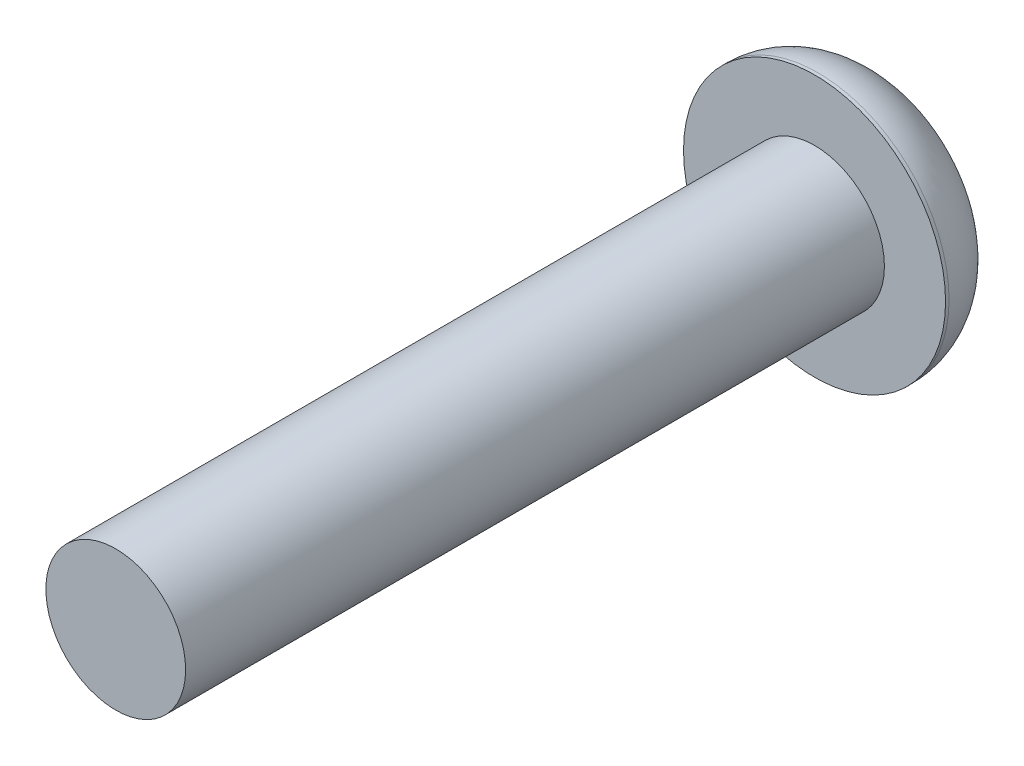
ISO-10303-21;
HEADER;
FILE_DESCRIPTION(('STEP AP214'),'2;1');
FILE_NAME('part.step','',(''),(''),'','','');
FILE_SCHEMA(('AUTOMOTIVE_DESIGN { 1 0 10303 214 1 1 1 1 }'));
ENDSEC;
DATA;
#1=APPLICATION_CONTEXT('core data for automotive mechanical design processes');
#2=APPLICATION_PROTOCOL_DEFINITION('international standard','automotive_design',2000,#1);
#3=PRODUCT_CONTEXT('',#1,'mechanical');
#4=PRODUCT('Part','Part','',(#3));
#5=PRODUCT_RELATED_PRODUCT_CATEGORY('part','',(#4));
#6=PRODUCT_DEFINITION_FORMATION('','',#4);
#7=PRODUCT_DEFINITION_CONTEXT('part definition',#1,'design');
#8=PRODUCT_DEFINITION('design','',#6,#7);
#9=PRODUCT_DEFINITION_SHAPE('','',#8);
#10=(LENGTH_UNIT() NAMED_UNIT(*) SI_UNIT(.MILLI.,.METRE.));
#11=(NAMED_UNIT(*) PLANE_ANGLE_UNIT() SI_UNIT($,.RADIAN.));
#12=(NAMED_UNIT(*) SI_UNIT($,.STERADIAN.) SOLID_ANGLE_UNIT());
#13=UNCERTAINTY_MEASURE_WITH_UNIT(LENGTH_MEASURE(1.E-05),#10,'distance_accuracy_value','');
#14=(GEOMETRIC_REPRESENTATION_CONTEXT(3) GLOBAL_UNCERTAINTY_ASSIGNED_CONTEXT((#13)) GLOBAL_UNIT_ASSIGNED_CONTEXT((#10,
#11,#12)) REPRESENTATION_CONTEXT('',''));
#15=CARTESIAN_POINT('',(0.,0.,0.));
#16=DIRECTION('',(0.,0.,1.));
#17=DIRECTION('',(1.,0.,0.));
#18=AXIS2_PLACEMENT_3D('',#15,#16,#17);
#19=CARTESIAN_POINT('',(0.,0.,20.));
#20=DIRECTION('',(0.,0.,-1.));
#21=DIRECTION('',(-1.,0.,0.));
#22=AXIS2_PLACEMENT_3D('',#19,#20,#21);
#23=CYLINDRICAL_SURFACE('',#22,2.);
#24=CARTESIAN_POINT('',(0.,0.,20.));
#25=DIRECTION('',(0.,0.,1.));
#26=DIRECTION('',(1.,0.,0.));
#27=AXIS2_PLACEMENT_3D('',#24,#25,#26);
#28=CIRCLE('',#27,2.);
#29=CARTESIAN_POINT('',(2.,0.,20.));
#30=VERTEX_POINT('',#29);
#31=EDGE_CURVE('E50',#30,#30,#28,.T.);
#32=ORIENTED_EDGE('',*,*,#31,.F.);
#33=EDGE_LOOP('',(#32));
#34=FACE_BOUND('',#33,.T.);
#35=CARTESIAN_POINT('',(0.,0.,0.));
#36=DIRECTION('',(0.,0.,1.));
#37=DIRECTION('',(1.,0.,0.));
#38=AXIS2_PLACEMENT_3D('',#35,#36,#37);
#39=CIRCLE('',#38,2.);
#40=CARTESIAN_POINT('',(2.,0.,0.));
#41=VERTEX_POINT('',#40);
#42=EDGE_CURVE('E55',#41,#41,#39,.T.);
#43=ORIENTED_EDGE('',*,*,#42,.T.);
#44=EDGE_LOOP('',(#43));
#45=FACE_BOUND('',#44,.T.);
#46=ADVANCED_FACE('F37',(#34,#45),#23,.T.);
#47=CARTESIAN_POINT('',(0.,0.,20.));
#48=DIRECTION('',(0.,0.,1.));
#49=DIRECTION('',(1.,0.,0.));
#50=AXIS2_PLACEMENT_3D('',#47,#48,#49);
#51=PLANE('',#50);
#52=ORIENTED_EDGE('',*,*,#31,.T.);
#53=EDGE_LOOP('',(#52));
#54=FACE_BOUND('',#53,.T.);
#55=ADVANCED_FACE('F82',(#54),#51,.T.);
#56=CARTESIAN_POINT('',(0.,0.,-2.1));
#57=DIRECTION('',(0.,0.,1.));
#58=DIRECTION('',(1.,0.,0.));
#59=AXIS2_PLACEMENT_3D('',#56,#57,#58);
#60=CYLINDRICAL_SURFACE('',#59,3.75);
#61=CARTESIAN_POINT('',(0.,0.,-0.1));
#62=DIRECTION('',(0.,0.,-1.));
#63=DIRECTION('',(-1.,0.,0.));
#64=AXIS2_PLACEMENT_3D('',#61,#62,#63);
#65=CIRCLE('',#64,3.75);
#66=CARTESIAN_POINT('',(-3.75,0.,-0.1));
#67=VERTEX_POINT('',#66);
#68=EDGE_CURVE('E10',#67,#67,#65,.F.);
#69=ORIENTED_EDGE('',*,*,#68,.T.);
#70=EDGE_LOOP('',(#69));
#71=FACE_BOUND('',#70,.T.);
#72=CARTESIAN_POINT('',(0.,0.,0.));
#73=DIRECTION('',(0.,0.,-1.));
#74=DIRECTION('',(-1.,0.,0.));
#75=AXIS2_PLACEMENT_3D('',#72,#73,#74);
#76=CIRCLE('',#75,3.75);
#77=CARTESIAN_POINT('',(-3.75,0.,0.));
#78=VERTEX_POINT('',#77);
#79=EDGE_CURVE('E60',#78,#78,#76,.T.);
#80=ORIENTED_EDGE('',*,*,#79,.T.);
#81=EDGE_LOOP('',(#80));
#82=FACE_BOUND('',#81,.T.);
#83=ADVANCED_FACE('F66',(#71,#82),#60,.T.);
#84=CARTESIAN_POINT('',(0.,0.,-2.1));
#85=DIRECTION('',(0.,0.,-1.));
#86=DIRECTION('',(-1.,0.,0.));
#87=AXIS2_PLACEMENT_3D('',#84,#85,#86);
#88=PLANE('',#87);
#89=CARTESIAN_POINT('',(0.,0.,-2.1));
#90=DIRECTION('',(0.,0.,-1.));
#91=DIRECTION('',(-1.,0.,0.));
#92=AXIS2_PLACEMENT_3D('',#89,#90,#91);
#93=CIRCLE('',#92,1.75);
#94=CARTESIAN_POINT('',(-1.75,0.,-2.1));
#95=VERTEX_POINT('',#94);
#96=EDGE_CURVE('E45',#95,#95,#93,.T.);
#97=ORIENTED_EDGE('',*,*,#96,.T.);
#98=EDGE_LOOP('',(#97));
#99=FACE_BOUND('',#98,.T.);
#100=ADVANCED_FACE('F70',(#99),#88,.T.);
#101=CARTESIAN_POINT('',(0.,0.,0.));
#102=DIRECTION('',(0.,0.,-1.));
#103=DIRECTION('',(-1.,0.,0.));
#104=AXIS2_PLACEMENT_3D('',#101,#102,#103);
#105=PLANE('',#104);
#106=ORIENTED_EDGE('',*,*,#42,.F.);
#107=EDGE_LOOP('',(#106));
#108=FACE_BOUND('',#107,.T.);
#109=ORIENTED_EDGE('',*,*,#79,.F.);
#110=EDGE_LOOP('',(#109));
#111=FACE_BOUND('',#110,.T.);
#112=ADVANCED_FACE('F68',(#108,#111),#105,.F.);
#113=CARTESIAN_POINT('',(0.,0.,-0.1));
#114=DIRECTION('',(0.,0.,-1.));
#115=DIRECTION('',(-1.,0.,0.));
#116=AXIS2_PLACEMENT_3D('',#113,#114,#115);
#117=DEGENERATE_TOROIDAL_SURFACE('',#116,1.75,2.,.T.);
#118=ORIENTED_EDGE('',*,*,#68,.F.);
#119=EDGE_LOOP('',(#118));
#120=FACE_BOUND('',#119,.T.);
#121=ORIENTED_EDGE('',*,*,#96,.F.);
#122=EDGE_LOOP('',(#121));
#123=FACE_BOUND('',#122,.T.);
#124=ADVANCED_FACE('F39',(#120,#123),#117,.T.);
#125=CLOSED_SHELL('',(#46,#55,#83,#100,#112,#124));
#126=MANIFOLD_SOLID_BREP('B2',#125);
#127=ADVANCED_BREP_SHAPE_REPRESENTATION('',(#18,#126),#14);
#128=SHAPE_DEFINITION_REPRESENTATION(#9,#127);
ENDSEC;
END-ISO-10303-21;
